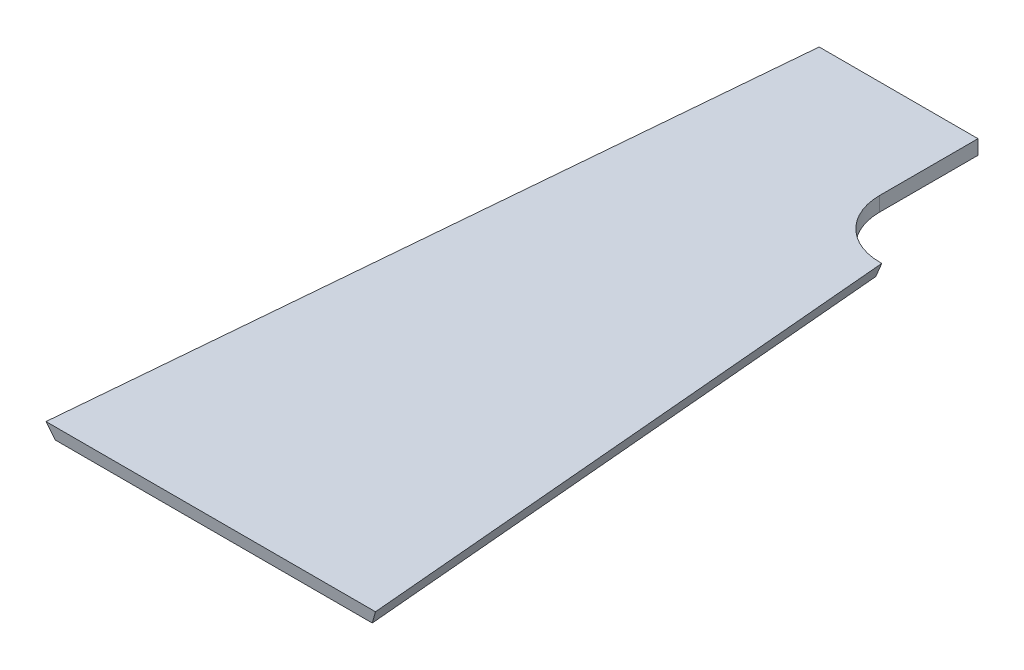
ISO-10303-21;
HEADER;
FILE_DESCRIPTION(('STEP AP214'),'2;1');
FILE_NAME('part.step','',(''),(''),'','','');
FILE_SCHEMA(('AUTOMOTIVE_DESIGN { 1 0 10303 214 1 1 1 1 }'));
ENDSEC;
DATA;
#1=APPLICATION_CONTEXT('core data for automotive mechanical design processes');
#2=APPLICATION_PROTOCOL_DEFINITION('international standard','automotive_design',2000,#1);
#3=PRODUCT_CONTEXT('',#1,'mechanical');
#4=PRODUCT('Part','Part','',(#3));
#5=PRODUCT_RELATED_PRODUCT_CATEGORY('part','',(#4));
#6=PRODUCT_DEFINITION_FORMATION('','',#4);
#7=PRODUCT_DEFINITION_CONTEXT('part definition',#1,'design');
#8=PRODUCT_DEFINITION('design','',#6,#7);
#9=PRODUCT_DEFINITION_SHAPE('','',#8);
#10=(LENGTH_UNIT() NAMED_UNIT(*) SI_UNIT(.MILLI.,.METRE.));
#11=(NAMED_UNIT(*) PLANE_ANGLE_UNIT() SI_UNIT($,.RADIAN.));
#12=(NAMED_UNIT(*) SI_UNIT($,.STERADIAN.) SOLID_ANGLE_UNIT());
#13=UNCERTAINTY_MEASURE_WITH_UNIT(LENGTH_MEASURE(1.E-05),#10,'distance_accuracy_value','');
#14=(GEOMETRIC_REPRESENTATION_CONTEXT(3) GLOBAL_UNCERTAINTY_ASSIGNED_CONTEXT((#13)) GLOBAL_UNIT_ASSIGNED_CONTEXT((#10,
#11,#12)) REPRESENTATION_CONTEXT('',''));
#15=CARTESIAN_POINT('',(0.,0.,0.));
#16=DIRECTION('',(0.,0.,1.));
#17=DIRECTION('',(1.,0.,0.));
#18=AXIS2_PLACEMENT_3D('',#15,#16,#17);
#19=CARTESIAN_POINT('',(-28.5,2.5,-61.5));
#20=DIRECTION('',(0.,0.,1.));
#21=DIRECTION('',(1.,0.,0.));
#22=AXIS2_PLACEMENT_3D('',#19,#20,#21);
#23=PLANE('',#22);
#24=DIRECTION('',(-1.,0.,0.));
#25=VECTOR('',#24,1.);
#26=CARTESIAN_POINT('',(-28.5,2.5,-61.5));
#27=LINE('',#26,#25);
#28=CARTESIAN_POINT('',(9.73889438631176,2.5,-61.5));
#29=VERTEX_POINT('',#28);
#30=CARTESIAN_POINT('',(-17.7388943863109,2.5,-61.5));
#31=VERTEX_POINT('',#30);
#32=EDGE_CURVE('E122',#29,#31,#27,.T.);
#33=ORIENTED_EDGE('',*,*,#32,.F.);
#34=DIRECTION('',(0.,1.,0.));
#35=VECTOR('',#34,1.);
#36=CARTESIAN_POINT('',(9.73889438631176,0.,-61.5));
#37=LINE('',#36,#35);
#38=CARTESIAN_POINT('',(9.73889438631176,0.,-61.5));
#39=VERTEX_POINT('',#38);
#40=EDGE_CURVE('E107',#39,#29,#37,.T.);
#41=ORIENTED_EDGE('',*,*,#40,.F.);
#42=DIRECTION('',(-1.,0.,0.));
#43=VECTOR('',#42,1.);
#44=CARTESIAN_POINT('',(-28.5,0.,-61.5));
#45=LINE('',#44,#43);
#46=CARTESIAN_POINT('',(-16.6994049090869,0.,-61.5));
#47=VERTEX_POINT('',#46);
#48=EDGE_CURVE('E120',#39,#47,#45,.T.);
#49=ORIENTED_EDGE('',*,*,#48,.T.);
#50=DIRECTION('',(-0.383930099614957,0.923362160048618,0.));
#51=VECTOR('',#50,1.);
#52=CARTESIAN_POINT('',(-19.3251063344954,6.31488216797659,-61.5));
#53=LINE('',#52,#51);
#54=EDGE_CURVE('E154',#47,#31,#53,.T.);
#55=ORIENTED_EDGE('',*,*,#54,.T.);
#56=EDGE_LOOP('',(#33,#41,#49,#55));
#57=FACE_BOUND('',#56,.T.);
#58=ADVANCED_FACE('F45',(#57),#23,.F.);
#59=CARTESIAN_POINT('',(0.,2.5,0.));
#60=DIRECTION('',(0.,-1.,0.));
#61=DIRECTION('',(0.,0.,-1.));
#62=AXIS2_PLACEMENT_3D('',#59,#60,#61);
#63=PLANE('',#62);
#64=DIRECTION('',(0.0871557427476548,0.,0.996194698091746));
#65=VECTOR('',#64,1.);
#66=CARTESIAN_POINT('',(28.5,2.5,61.5));
#67=LINE('',#66,#65);
#68=CARTESIAN_POINT('',(20.1016535709449,2.5,-34.4935389408118));
#69=VERTEX_POINT('',#68);
#70=CARTESIAN_POINT('',(28.5,2.5,61.5));
#71=VERTEX_POINT('',#70);
#72=EDGE_CURVE('E145',#69,#71,#67,.T.);
#73=ORIENTED_EDGE('',*,*,#72,.F.);
#74=DIRECTION('',(0.999997693505258,0.,0.00214778587470094));
#75=VECTOR('',#74,1.);
#76=CARTESIAN_POINT('',(19.7174165275649,2.5,-34.4943642016096));
#77=LINE('',#76,#75);
#78=CARTESIAN_POINT('',(19.7174165275649,2.5,-34.4943642016096));
#79=VERTEX_POINT('',#78);
#80=EDGE_CURVE('E115',#79,#69,#77,.T.);
#81=ORIENTED_EDGE('',*,*,#80,.F.);
#82=CARTESIAN_POINT('',(19.7388943863118,2.5,-44.4943411366622));
#83=DIRECTION('',(0.,1.,0.));
#84=DIRECTION('',(0.,0.,1.));
#85=AXIS2_PLACEMENT_3D('',#82,#83,#84);
#86=CIRCLE('',#85,10.);
#87=CARTESIAN_POINT('',(9.73889438631176,2.5,-44.4943411366623));
#88=VERTEX_POINT('',#87);
#89=EDGE_CURVE('E165',#88,#79,#86,.T.);
#90=ORIENTED_EDGE('',*,*,#89,.F.);
#91=DIRECTION('',(0.,0.,1.));
#92=VECTOR('',#91,1.);
#93=CARTESIAN_POINT('',(9.73889438631176,2.5,-44.5));
#94=LINE('',#93,#92);
#95=EDGE_CURVE('E167',#29,#88,#94,.T.);
#96=ORIENTED_EDGE('',*,*,#95,.F.);
#97=ORIENTED_EDGE('',*,*,#32,.T.);
#98=DIRECTION('',(0.0871557427476617,0.,-0.996194698091745));
#99=VECTOR('',#98,1.);
#100=CARTESIAN_POINT('',(-28.5,2.5,61.5));
#101=LINE('',#100,#99);
#102=CARTESIAN_POINT('',(-28.5,2.5,61.5));
#103=VERTEX_POINT('',#102);
#104=EDGE_CURVE('E133',#103,#31,#101,.T.);
#105=ORIENTED_EDGE('',*,*,#104,.F.);
#106=DIRECTION('',(1.,0.,0.));
#107=VECTOR('',#106,1.);
#108=CARTESIAN_POINT('',(-28.5,2.5,61.5));
#109=LINE('',#108,#107);
#110=EDGE_CURVE('E130',#103,#71,#109,.T.);
#111=ORIENTED_EDGE('',*,*,#110,.T.);
#112=EDGE_LOOP('',(#73,#81,#90,#96,#97,#105,#111));
#113=FACE_BOUND('',#112,.T.);
#114=ADVANCED_FACE('F143',(#113),#63,.F.);
#115=CARTESIAN_POINT('',(0.,0.,0.));
#116=DIRECTION('',(0.,-1.,0.));
#117=DIRECTION('',(0.,0.,-1.));
#118=AXIS2_PLACEMENT_3D('',#115,#116,#117);
#119=PLANE('',#118);
#120=CARTESIAN_POINT('',(19.7388943863118,0.,-44.4943411366622));
#121=DIRECTION('',(0.,1.,0.));
#122=DIRECTION('',(0.,0.,1.));
#123=AXIS2_PLACEMENT_3D('',#120,#121,#122);
#124=CIRCLE('',#123,10.);
#125=CARTESIAN_POINT('',(9.73889438631176,0.,-44.4943411366623));
#126=VERTEX_POINT('',#125);
#127=CARTESIAN_POINT('',(19.0600758681352,0.,-34.5174074684763));
#128=VERTEX_POINT('',#127);
#129=EDGE_CURVE('E114',#126,#128,#124,.T.);
#130=ORIENTED_EDGE('',*,*,#129,.T.);
#131=DIRECTION('',(0.0871557427476548,0.,0.996194698091746));
#132=VECTOR('',#131,1.);
#133=CARTESIAN_POINT('',(16.3560646475477,0.,-65.4243971470463));
#134=LINE('',#133,#132);
#135=CARTESIAN_POINT('',(27.4140197990155,0.,60.9686085958249));
#136=VERTEX_POINT('',#135);
#137=EDGE_CURVE('E151',#128,#136,#134,.T.);
#138=ORIENTED_EDGE('',*,*,#137,.T.);
#139=DIRECTION('',(1.,0.,0.));
#140=VECTOR('',#139,1.);
#141=CARTESIAN_POINT('',(-28.5,0.,60.9686085958249));
#142=LINE('',#141,#140);
#143=CARTESIAN_POINT('',(-27.4140197990155,0.,60.968608595825));
#144=VERTEX_POINT('',#143);
#145=EDGE_CURVE('E128',#144,#136,#142,.T.);
#146=ORIENTED_EDGE('',*,*,#145,.F.);
#147=DIRECTION('',(-0.0871557427476618,0.,0.996194698091745));
#148=VECTOR('',#147,1.);
#149=CARTESIAN_POINT('',(-16.3560646475468,0.,-65.4243971470465));
#150=LINE('',#149,#148);
#151=EDGE_CURVE('E127',#47,#144,#150,.T.);
#152=ORIENTED_EDGE('',*,*,#151,.F.);
#153=ORIENTED_EDGE('',*,*,#48,.F.);
#154=DIRECTION('',(0.,0.,1.));
#155=VECTOR('',#154,1.);
#156=CARTESIAN_POINT('',(9.73889438631176,0.,-61.5));
#157=LINE('',#156,#155);
#158=EDGE_CURVE('E103',#39,#126,#157,.T.);
#159=ORIENTED_EDGE('',*,*,#158,.T.);
#160=EDGE_LOOP('',(#130,#138,#146,#152,#153,#159));
#161=FACE_BOUND('',#160,.T.);
#162=ADVANCED_FACE('F125',(#161),#119,.T.);
#163=CARTESIAN_POINT('',(-28.5,0.,60.9686085958249));
#164=DIRECTION('',(0.,0.207911690817761,-0.978147600733805));
#165=DIRECTION('',(0.,0.978147600733805,0.207911690817761));
#166=AXIS2_PLACEMENT_3D('',#163,#164,#165);
#167=PLANE('',#166);
#168=ORIENTED_EDGE('',*,*,#110,.F.);
#169=DIRECTION('',(0.391062348992312,-0.900252022637708,-0.191354474568356));
#170=VECTOR('',#169,1.);
#171=CARTESIAN_POINT('',(-27.580098491385,0.382324401998462,61.0498741561563));
#172=LINE('',#171,#170);
#173=EDGE_CURVE('E67',#103,#144,#172,.T.);
#174=ORIENTED_EDGE('',*,*,#173,.T.);
#175=ORIENTED_EDGE('',*,*,#145,.T.);
#176=DIRECTION('',(0.391062348992305,0.900252022637711,0.191354474568357));
#177=VECTOR('',#176,1.);
#178=CARTESIAN_POINT('',(18.8631021258203,-19.6847918254948,56.7844769282076));
#179=LINE('',#178,#177);
#180=EDGE_CURVE('E150',#136,#71,#179,.T.);
#181=ORIENTED_EDGE('',*,*,#180,.T.);
#182=EDGE_LOOP('',(#168,#174,#175,#181));
#183=FACE_BOUND('',#182,.T.);
#184=ADVANCED_FACE('F148',(#183),#167,.F.);
#185=CARTESIAN_POINT('',(16.3560646475477,0.,-65.4243971470463));
#186=DIRECTION('',(-0.920363891963226,0.382683432365086,0.0805214068653775));
#187=DIRECTION('',(-0.383930099614951,-0.92336216004862,0.));
#188=AXIS2_PLACEMENT_3D('',#185,#186,#187);
#189=PLANE('',#188);
#190=CARTESIAN_POINT('',(19.7388943863118,3.73184901071989,-44.4943411366622));
#191=DIRECTION('',(-0.920363891963226,0.382683432365086,0.0805214068653775));
#192=DIRECTION('',(0.38122720636965,0.923879532511288,-0.033353058785001));
#193=AXIS2_PLACEMENT_3D('',#190,#191,#192);
#194=ELLIPSE('',#193,26.1312592975278,10.);
#195=CARTESIAN_POINT('',(19.7174165275649,1.57607327723576,-34.4943642016096));
#196=VERTEX_POINT('',#195);
#197=EDGE_CURVE('E52',#128,#196,#194,.T.);
#198=ORIENTED_EDGE('',*,*,#197,.T.);
#199=DIRECTION('',(0.383991487225158,0.92333626461514,0.00082473339451084));
#200=VECTOR('',#199,1.);
#201=CARTESIAN_POINT('',(18.6531898225635,-0.982939469636539,-34.4966499379661));
#202=LINE('',#201,#200);
#203=EDGE_CURVE('E11',#196,#69,#202,.T.);
#204=ORIENTED_EDGE('',*,*,#203,.T.);
#205=ORIENTED_EDGE('',*,*,#72,.T.);
#206=ORIENTED_EDGE('',*,*,#180,.F.);
#207=ORIENTED_EDGE('',*,*,#137,.F.);
#208=EDGE_LOOP('',(#198,#204,#205,#206,#207));
#209=FACE_BOUND('',#208,.T.);
#210=ADVANCED_FACE('F169',(#209),#189,.F.);
#211=CARTESIAN_POINT('',(-17.3876580343312,2.5,-65.5146498737584));
#212=DIRECTION('',(0.920363891963223,0.382683432365092,0.0805214068653837));
#213=DIRECTION('',(-0.383930099614957,0.923362160048618,0.));
#214=AXIS2_PLACEMENT_3D('',#211,#212,#213);
#215=PLANE('',#214);
#216=ORIENTED_EDGE('',*,*,#151,.T.);
#217=ORIENTED_EDGE('',*,*,#173,.F.);
#218=ORIENTED_EDGE('',*,*,#104,.T.);
#219=ORIENTED_EDGE('',*,*,#54,.F.);
#220=EDGE_LOOP('',(#216,#217,#218,#219));
#221=FACE_BOUND('',#220,.T.);
#222=ADVANCED_FACE('F158',(#221),#215,.F.);
#223=CARTESIAN_POINT('',(19.7174165275649,0.,-34.4943642016096));
#224=DIRECTION('',(-0.00214778587470094,0.,0.999997693505258));
#225=DIRECTION('',(0.999997693505258,0.,0.00214778587470094));
#226=AXIS2_PLACEMENT_3D('',#223,#224,#225);
#227=PLANE('',#226);
#228=DIRECTION('',(0.,1.,0.));
#229=VECTOR('',#228,1.);
#230=CARTESIAN_POINT('',(19.7174165275649,0.,-34.4943642016096));
#231=LINE('',#230,#229);
#232=EDGE_CURVE('E59',#196,#79,#231,.T.);
#233=ORIENTED_EDGE('',*,*,#232,.T.);
#234=ORIENTED_EDGE('',*,*,#80,.T.);
#235=ORIENTED_EDGE('',*,*,#203,.F.);
#236=EDGE_LOOP('',(#233,#234,#235));
#237=FACE_BOUND('',#236,.T.);
#238=ADVANCED_FACE('F177',(#237),#227,.F.);
#239=CARTESIAN_POINT('',(19.7388943863118,0.,-44.4943411366622));
#240=DIRECTION('',(0.,1.,0.));
#241=DIRECTION('',(0.,0.,1.));
#242=AXIS2_PLACEMENT_3D('',#239,#240,#241);
#243=CYLINDRICAL_SURFACE('',#242,10.);
#244=ORIENTED_EDGE('',*,*,#129,.F.);
#245=DIRECTION('',(0.,1.,0.));
#246=VECTOR('',#245,1.);
#247=CARTESIAN_POINT('',(9.73889438631176,0.,-44.4943411366623));
#248=LINE('',#247,#246);
#249=EDGE_CURVE('E109',#126,#88,#248,.T.);
#250=ORIENTED_EDGE('',*,*,#249,.T.);
#251=ORIENTED_EDGE('',*,*,#89,.T.);
#252=ORIENTED_EDGE('',*,*,#232,.F.);
#253=ORIENTED_EDGE('',*,*,#197,.F.);
#254=EDGE_LOOP('',(#244,#250,#251,#252,#253));
#255=FACE_BOUND('',#254,.T.);
#256=ADVANCED_FACE('F218',(#255),#243,.F.);
#257=CARTESIAN_POINT('',(9.73889438631176,0.,-44.5));
#258=DIRECTION('',(-1.,0.,0.));
#259=DIRECTION('',(0.,0.,1.));
#260=AXIS2_PLACEMENT_3D('',#257,#258,#259);
#261=PLANE('',#260);
#262=ORIENTED_EDGE('',*,*,#95,.T.);
#263=ORIENTED_EDGE('',*,*,#249,.F.);
#264=ORIENTED_EDGE('',*,*,#158,.F.);
#265=ORIENTED_EDGE('',*,*,#40,.T.);
#266=EDGE_LOOP('',(#262,#263,#264,#265));
#267=FACE_BOUND('',#266,.T.);
#268=ADVANCED_FACE('F106',(#267),#261,.F.);
#269=CLOSED_SHELL('',(#58,#114,#162,#184,#210,#222,#238,#256,#268));
#270=MANIFOLD_SOLID_BREP('B2',#269);
#271=ADVANCED_BREP_SHAPE_REPRESENTATION('',(#18,#270),#14);
#272=SHAPE_DEFINITION_REPRESENTATION(#9,#271);
ENDSEC;
END-ISO-10303-21;
